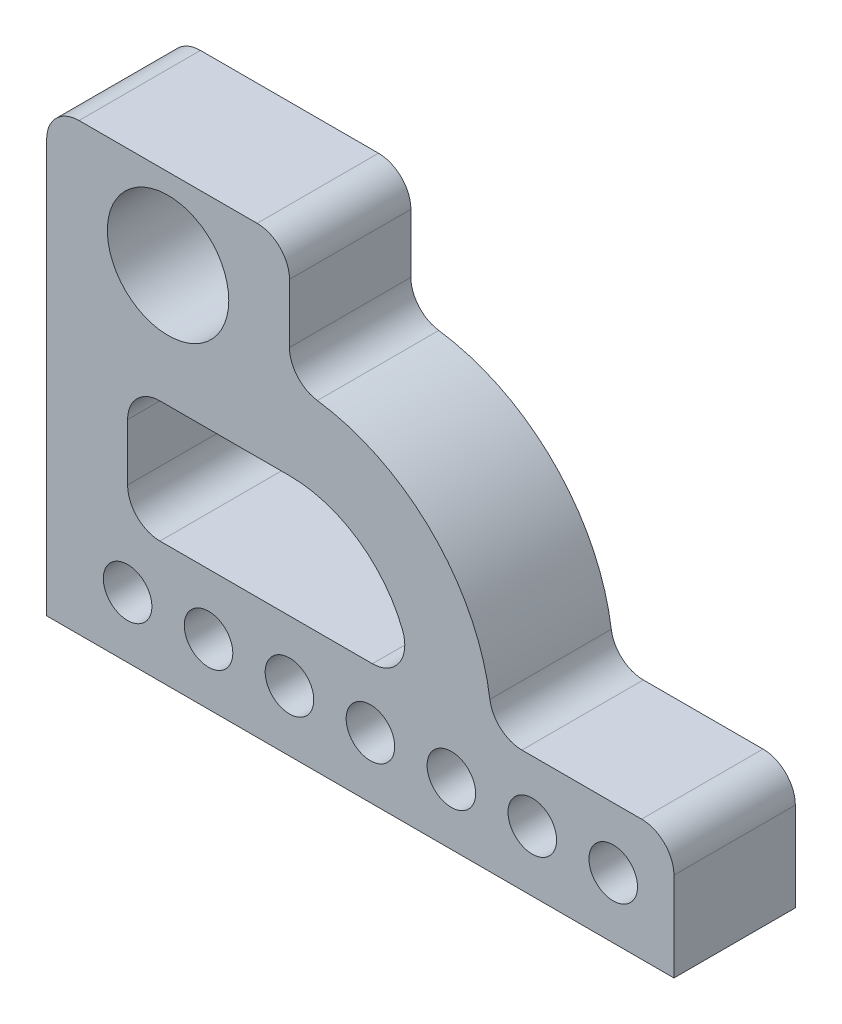
ISO-10303-21;
HEADER;
FILE_DESCRIPTION(('STEP AP214'),'2;1');
FILE_NAME('part.step','',(''),(''),'','','');
FILE_SCHEMA(('AUTOMOTIVE_DESIGN { 1 0 10303 214 1 1 1 1 }'));
ENDSEC;
DATA;
#1=APPLICATION_CONTEXT('core data for automotive mechanical design processes');
#2=APPLICATION_PROTOCOL_DEFINITION('international standard','automotive_design',2000,#1);
#3=PRODUCT_CONTEXT('',#1,'mechanical');
#4=PRODUCT('Part','Part','',(#3));
#5=PRODUCT_RELATED_PRODUCT_CATEGORY('part','',(#4));
#6=PRODUCT_DEFINITION_FORMATION('','',#4);
#7=PRODUCT_DEFINITION_CONTEXT('part definition',#1,'design');
#8=PRODUCT_DEFINITION('design','',#6,#7);
#9=PRODUCT_DEFINITION_SHAPE('','',#8);
#10=(LENGTH_UNIT() NAMED_UNIT(*) SI_UNIT(.MILLI.,.METRE.));
#11=(NAMED_UNIT(*) PLANE_ANGLE_UNIT() SI_UNIT($,.RADIAN.));
#12=(NAMED_UNIT(*) SI_UNIT($,.STERADIAN.) SOLID_ANGLE_UNIT());
#13=UNCERTAINTY_MEASURE_WITH_UNIT(LENGTH_MEASURE(1.E-05),#10,'distance_accuracy_value','');
#14=(GEOMETRIC_REPRESENTATION_CONTEXT(3) GLOBAL_UNCERTAINTY_ASSIGNED_CONTEXT((#13)) GLOBAL_UNIT_ASSIGNED_CONTEXT((#10,
#11,#12)) REPRESENTATION_CONTEXT('',''));
#15=CARTESIAN_POINT('',(0.,0.,0.));
#16=DIRECTION('',(0.,0.,1.));
#17=DIRECTION('',(1.,0.,0.));
#18=AXIS2_PLACEMENT_3D('',#15,#16,#17);
#19=CARTESIAN_POINT('',(-82.8411214953271,71.5579771921026,30.));
#20=DIRECTION('',(0.,0.,-1.));
#21=DIRECTION('',(-1.,0.,0.));
#22=AXIS2_PLACEMENT_3D('',#19,#20,#21);
#23=PLANE('',#22);
#24=DIRECTION('',(0.,-1.,0.));
#25=VECTOR('',#24,1.);
#26=CARTESIAN_POINT('',(-70.8411214953271,0.,30.));
#27=LINE('',#26,#25);
#28=CARTESIAN_POINT('',(-70.8411214953271,21.5579771921025,30.));
#29=VERTEX_POINT('',#28);
#30=CARTESIAN_POINT('',(-70.8411214953271,7.55797719210254,30.));
#31=VERTEX_POINT('',#30);
#32=EDGE_CURVE('E545',#29,#31,#27,.T.);
#33=ORIENTED_EDGE('',*,*,#32,.F.);
#34=CARTESIAN_POINT('',(-62.8411214953271,21.5579771921025,30.));
#35=DIRECTION('',(0.,0.,1.));
#36=DIRECTION('',(1.,0.,0.));
#37=AXIS2_PLACEMENT_3D('',#34,#35,#36);
#38=CIRCLE('',#37,8.);
#39=CARTESIAN_POINT('',(-62.8411214953271,29.5579771921025,30.));
#40=VERTEX_POINT('',#39);
#41=EDGE_CURVE('E554',#29,#40,#38,.F.);
#42=ORIENTED_EDGE('',*,*,#41,.T.);
#43=DIRECTION('',(-1.,0.,0.));
#44=VECTOR('',#43,1.);
#45=CARTESIAN_POINT('',(0.,29.5579771921025,30.));
#46=LINE('',#45,#44);
#47=CARTESIAN_POINT('',(-30.8411214953271,29.5579771921025,30.));
#48=VERTEX_POINT('',#47);
#49=EDGE_CURVE('E582',#48,#40,#46,.T.);
#50=ORIENTED_EDGE('',*,*,#49,.F.);
#51=CARTESIAN_POINT('',(-30.8411214953271,-0.442022807897458,30.));
#52=DIRECTION('',(0.,0.,1.));
#53=DIRECTION('',(1.,0.,0.));
#54=AXIS2_PLACEMENT_3D('',#51,#52,#53);
#55=CIRCLE('',#54,30.);
#56=CARTESIAN_POINT('',(-2.89489213361911,10.4670681011935,30.));
#57=VERTEX_POINT('',#56);
#58=EDGE_CURVE('E579',#57,#48,#55,.T.);
#59=ORIENTED_EDGE('',*,*,#58,.F.);
#60=CARTESIAN_POINT('',(-10.3472199634079,7.55797719210254,30.));
#61=DIRECTION('',(0.,0.,1.));
#62=DIRECTION('',(1.,0.,0.));
#63=AXIS2_PLACEMENT_3D('',#60,#61,#62);
#64=CIRCLE('',#63,8.);
#65=CARTESIAN_POINT('',(-10.3472199634079,-0.442022807897458,30.));
#66=VERTEX_POINT('',#65);
#67=EDGE_CURVE('E576',#66,#57,#64,.T.);
#68=ORIENTED_EDGE('',*,*,#67,.F.);
#69=DIRECTION('',(1.,0.,0.));
#70=VECTOR('',#69,1.);
#71=CARTESIAN_POINT('',(0.,-0.442022807897458,30.));
#72=LINE('',#71,#70);
#73=CARTESIAN_POINT('',(-62.8411214953271,-0.442022807897458,30.));
#74=VERTEX_POINT('',#73);
#75=EDGE_CURVE('E570',#74,#66,#72,.T.);
#76=ORIENTED_EDGE('',*,*,#75,.F.);
#77=CARTESIAN_POINT('',(-62.8411214953271,7.55797719210254,30.));
#78=DIRECTION('',(0.,0.,1.));
#79=DIRECTION('',(1.,0.,0.));
#80=AXIS2_PLACEMENT_3D('',#77,#78,#79);
#81=CIRCLE('',#80,8.);
#82=EDGE_CURVE('E566',#74,#31,#81,.F.);
#83=ORIENTED_EDGE('',*,*,#82,.T.);
#84=EDGE_LOOP('',(#33,#42,#50,#59,#68,#76,#83));
#85=FACE_BOUND('',#84,.T.);
#86=CARTESIAN_POINT('',(-82.8411214953271,71.5579771921026,30.));
#87=DIRECTION('',(0.,0.,-1.));
#88=DIRECTION('',(-1.,0.,0.));
#89=AXIS2_PLACEMENT_3D('',#86,#87,#88);
#90=CIRCLE('',#89,8.00000000000001);
#91=CARTESIAN_POINT('',(-90.8411214953271,71.5579771921026,30.));
#92=VERTEX_POINT('',#91);
#93=CARTESIAN_POINT('',(-82.8411214953271,79.5579771921025,30.));
#94=VERTEX_POINT('',#93);
#95=EDGE_CURVE('E632',#92,#94,#90,.T.);
#96=ORIENTED_EDGE('',*,*,#95,.F.);
#97=DIRECTION('',(0.,-1.,0.));
#98=VECTOR('',#97,1.);
#99=CARTESIAN_POINT('',(-90.8411214953271,71.5579771921026,30.));
#100=LINE('',#99,#98);
#101=CARTESIAN_POINT('',(-90.8411214953271,-30.4420228078975,30.));
#102=VERTEX_POINT('',#101);
#103=EDGE_CURVE('E670',#92,#102,#100,.T.);
#104=ORIENTED_EDGE('',*,*,#103,.T.);
#105=DIRECTION('',(1.,0.,0.));
#106=VECTOR('',#105,1.);
#107=CARTESIAN_POINT('',(-90.8411214953271,-30.4420228078975,30.));
#108=LINE('',#107,#106);
#109=CARTESIAN_POINT('',(64.1588785046729,-30.4420228078975,30.));
#110=VERTEX_POINT('',#109);
#111=EDGE_CURVE('E667',#102,#110,#108,.T.);
#112=ORIENTED_EDGE('',*,*,#111,.T.);
#113=DIRECTION('',(0.,1.,0.));
#114=VECTOR('',#113,1.);
#115=CARTESIAN_POINT('',(64.1588785046729,-30.4420228078975,30.));
#116=LINE('',#115,#114);
#117=CARTESIAN_POINT('',(64.1588785046729,-8.44202280789746,30.));
#118=VERTEX_POINT('',#117);
#119=EDGE_CURVE('E664',#110,#118,#116,.T.);
#120=ORIENTED_EDGE('',*,*,#119,.T.);
#121=CARTESIAN_POINT('',(56.1588785046729,-8.44202280789746,30.));
#122=DIRECTION('',(0.,0.,1.));
#123=DIRECTION('',(1.,0.,0.));
#124=AXIS2_PLACEMENT_3D('',#121,#122,#123);
#125=CIRCLE('',#124,7.99999999999999);
#126=CARTESIAN_POINT('',(56.1588785046729,-0.442022807897464,30.));
#127=VERTEX_POINT('',#126);
#128=EDGE_CURVE('E661',#118,#127,#125,.T.);
#129=ORIENTED_EDGE('',*,*,#128,.T.);
#130=DIRECTION('',(-1.,0.,0.));
#131=VECTOR('',#130,1.);
#132=CARTESIAN_POINT('',(56.1588785046729,-0.442022807897459,30.));
#133=LINE('',#132,#131);
#134=CARTESIAN_POINT('',(26.6045049700532,-0.442022807897463,30.));
#135=VERTEX_POINT('',#134);
#136=EDGE_CURVE('E658',#127,#135,#133,.T.);
#137=ORIENTED_EDGE('',*,*,#136,.T.);
#138=CARTESIAN_POINT('',(26.6045049700532,7.55797719210254,30.));
#139=DIRECTION('',(0.,0.,-1.));
#140=DIRECTION('',(-1.,0.,0.));
#141=AXIS2_PLACEMENT_3D('',#138,#139,#140);
#142=CIRCLE('',#141,8.);
#143=CARTESIAN_POINT('',(18.6809702851732,6.45452891624047,30.));
#144=VERTEX_POINT('',#143);
#145=EDGE_CURVE('E655',#135,#144,#142,.T.);
#146=ORIENTED_EDGE('',*,*,#145,.T.);
#147=CARTESIAN_POINT('',(-30.8411214953271,-0.442022807897458,30.));
#148=DIRECTION('',(0.,0.,-1.));
#149=DIRECTION('',(-1.,0.,0.));
#150=AXIS2_PLACEMENT_3D('',#147,#148,#149);
#151=CIRCLE('',#150,50.);
#152=CARTESIAN_POINT('',(-23.9445697711892,49.0800689726028,30.));
#153=VERTEX_POINT('',#152);
#154=EDGE_CURVE('E651',#153,#144,#151,.T.);
#155=ORIENTED_EDGE('',*,*,#154,.F.);
#156=CARTESIAN_POINT('',(-22.8411214953271,57.0036036574828,30.));
#157=DIRECTION('',(0.,0.,-1.));
#158=DIRECTION('',(-1.,0.,0.));
#159=AXIS2_PLACEMENT_3D('',#156,#157,#158);
#160=CIRCLE('',#159,8.);
#161=CARTESIAN_POINT('',(-30.8411214953271,57.0036036574828,30.));
#162=VERTEX_POINT('',#161);
#163=EDGE_CURVE('E648',#153,#162,#160,.T.);
#164=ORIENTED_EDGE('',*,*,#163,.T.);
#165=DIRECTION('',(0.,-1.,0.));
#166=VECTOR('',#165,1.);
#167=CARTESIAN_POINT('',(-30.8411214953271,71.5579771921026,30.));
#168=LINE('',#167,#166);
#169=CARTESIAN_POINT('',(-30.8411214953271,71.5579771921026,30.));
#170=VERTEX_POINT('',#169);
#171=EDGE_CURVE('E644',#170,#162,#168,.T.);
#172=ORIENTED_EDGE('',*,*,#171,.F.);
#173=CARTESIAN_POINT('',(-38.8411214953271,71.5579771921026,30.));
#174=DIRECTION('',(0.,0.,1.));
#175=DIRECTION('',(1.,0.,0.));
#176=AXIS2_PLACEMENT_3D('',#173,#174,#175);
#177=CIRCLE('',#176,8.);
#178=CARTESIAN_POINT('',(-38.8411214953271,79.5579771921025,30.));
#179=VERTEX_POINT('',#178);
#180=EDGE_CURVE('E641',#170,#179,#177,.T.);
#181=ORIENTED_EDGE('',*,*,#180,.T.);
#182=DIRECTION('',(1.,0.,0.));
#183=VECTOR('',#182,1.);
#184=CARTESIAN_POINT('',(-82.8411214953271,79.5579771921025,30.));
#185=LINE('',#184,#183);
#186=EDGE_CURVE('E636',#94,#179,#185,.T.);
#187=ORIENTED_EDGE('',*,*,#186,.F.);
#188=EDGE_LOOP('',(#96,#104,#112,#120,#129,#137,#146,#155,#164,#172,#181,#187));
#189=FACE_BOUND('',#188,.T.);
#190=CARTESIAN_POINT('',(-60.8411214953271,59.5579771921025,30.));
#191=DIRECTION('',(0.,0.,1.));
#192=DIRECTION('',(1.,0.,0.));
#193=AXIS2_PLACEMENT_3D('',#190,#191,#192);
#194=CIRCLE('',#193,15.);
#195=CARTESIAN_POINT('',(-45.8411214953271,59.5579771921025,30.));
#196=VERTEX_POINT('',#195);
#197=EDGE_CURVE('E624',#196,#196,#194,.T.);
#198=ORIENTED_EDGE('',*,*,#197,.F.);
#199=EDGE_LOOP('',(#198));
#200=FACE_BOUND('',#199,.T.);
#201=CARTESIAN_POINT('',(-50.8411214953271,-15.4420228078975,30.));
#202=DIRECTION('',(0.,0.,1.));
#203=DIRECTION('',(1.,0.,0.));
#204=AXIS2_PLACEMENT_3D('',#201,#202,#203);
#205=CIRCLE('',#204,6.);
#206=CARTESIAN_POINT('',(-44.8411214953271,-15.4420228078975,30.));
#207=VERTEX_POINT('',#206);
#208=EDGE_CURVE('E587',#207,#207,#205,.T.);
#209=ORIENTED_EDGE('',*,*,#208,.F.);
#210=EDGE_LOOP('',(#209));
#211=FACE_BOUND('',#210,.T.);
#212=CARTESIAN_POINT('',(-30.8411214953271,-15.4420228078975,30.));
#213=DIRECTION('',(0.,0.,1.));
#214=DIRECTION('',(1.,0.,0.));
#215=AXIS2_PLACEMENT_3D('',#212,#213,#214);
#216=CIRCLE('',#215,6.);
#217=CARTESIAN_POINT('',(-24.8411214953271,-15.4420228078975,30.));
#218=VERTEX_POINT('',#217);
#219=EDGE_CURVE('E1143',#218,#218,#216,.T.);
#220=ORIENTED_EDGE('',*,*,#219,.F.);
#221=EDGE_LOOP('',(#220));
#222=FACE_BOUND('',#221,.T.);
#223=CARTESIAN_POINT('',(9.15887850467292,-15.4420228078975,30.));
#224=DIRECTION('',(0.,0.,1.));
#225=DIRECTION('',(1.,0.,0.));
#226=AXIS2_PLACEMENT_3D('',#223,#224,#225);
#227=CIRCLE('',#226,6.);
#228=CARTESIAN_POINT('',(15.1588785046729,-15.4420228078975,30.));
#229=VERTEX_POINT('',#228);
#230=EDGE_CURVE('E1135',#229,#229,#227,.T.);
#231=ORIENTED_EDGE('',*,*,#230,.F.);
#232=EDGE_LOOP('',(#231));
#233=FACE_BOUND('',#232,.T.);
#234=CARTESIAN_POINT('',(29.1588785046729,-15.4420228078975,30.));
#235=DIRECTION('',(0.,0.,1.));
#236=DIRECTION('',(1.,0.,0.));
#237=AXIS2_PLACEMENT_3D('',#234,#235,#236);
#238=CIRCLE('',#237,6.);
#239=CARTESIAN_POINT('',(35.1588785046729,-15.4420228078975,30.));
#240=VERTEX_POINT('',#239);
#241=EDGE_CURVE('E1127',#240,#240,#238,.T.);
#242=ORIENTED_EDGE('',*,*,#241,.F.);
#243=EDGE_LOOP('',(#242));
#244=FACE_BOUND('',#243,.T.);
#245=CARTESIAN_POINT('',(49.1588785046729,-15.4420228078975,30.));
#246=DIRECTION('',(0.,0.,1.));
#247=DIRECTION('',(1.,0.,0.));
#248=AXIS2_PLACEMENT_3D('',#245,#246,#247);
#249=CIRCLE('',#248,6.);
#250=CARTESIAN_POINT('',(55.1588785046729,-15.4420228078975,30.));
#251=VERTEX_POINT('',#250);
#252=EDGE_CURVE('E1119',#251,#251,#249,.T.);
#253=ORIENTED_EDGE('',*,*,#252,.F.);
#254=EDGE_LOOP('',(#253));
#255=FACE_BOUND('',#254,.T.);
#256=CARTESIAN_POINT('',(-70.8411214953271,-15.4420228078975,30.));
#257=DIRECTION('',(0.,0.,1.));
#258=DIRECTION('',(1.,0.,0.));
#259=AXIS2_PLACEMENT_3D('',#256,#257,#258);
#260=CIRCLE('',#259,6.);
#261=CARTESIAN_POINT('',(-64.8411214953271,-15.4420228078975,30.));
#262=VERTEX_POINT('',#261);
#263=EDGE_CURVE('E1111',#262,#262,#260,.T.);
#264=ORIENTED_EDGE('',*,*,#263,.F.);
#265=EDGE_LOOP('',(#264));
#266=FACE_BOUND('',#265,.T.);
#267=CARTESIAN_POINT('',(-10.8411214953271,-15.4420228078975,30.));
#268=DIRECTION('',(0.,0.,1.));
#269=DIRECTION('',(1.,0.,0.));
#270=AXIS2_PLACEMENT_3D('',#267,#268,#269);
#271=CIRCLE('',#270,6.);
#272=CARTESIAN_POINT('',(-4.84112149532708,-15.4420228078975,30.));
#273=VERTEX_POINT('',#272);
#274=EDGE_CURVE('E1100',#273,#273,#271,.T.);
#275=ORIENTED_EDGE('',*,*,#274,.F.);
#276=EDGE_LOOP('',(#275));
#277=FACE_BOUND('',#276,.T.);
#278=ADVANCED_FACE('F408',(#85,#189,#200,#211,#222,#233,#244,#255,#266,#277),#23,.F.);
#279=CARTESIAN_POINT('',(-82.8411214953271,71.5579771921026,0.));
#280=DIRECTION('',(0.,0.,-1.));
#281=DIRECTION('',(-1.,0.,0.));
#282=AXIS2_PLACEMENT_3D('',#279,#280,#281);
#283=PLANE('',#282);
#284=CARTESIAN_POINT('',(-70.8411214953271,-15.4420228078975,0.));
#285=DIRECTION('',(0.,0.,1.));
#286=DIRECTION('',(1.,0.,0.));
#287=AXIS2_PLACEMENT_3D('',#284,#285,#286);
#288=CIRCLE('',#287,6.);
#289=CARTESIAN_POINT('',(-64.8411214953271,-15.4420228078975,0.));
#290=VERTEX_POINT('',#289);
#291=EDGE_CURVE('E1108',#290,#290,#288,.T.);
#292=ORIENTED_EDGE('',*,*,#291,.T.);
#293=EDGE_LOOP('',(#292));
#294=FACE_BOUND('',#293,.T.);
#295=CARTESIAN_POINT('',(29.1588785046729,-15.4420228078975,0.));
#296=DIRECTION('',(0.,0.,1.));
#297=DIRECTION('',(1.,0.,0.));
#298=AXIS2_PLACEMENT_3D('',#295,#296,#297);
#299=CIRCLE('',#298,6.);
#300=CARTESIAN_POINT('',(35.1588785046729,-15.4420228078975,0.));
#301=VERTEX_POINT('',#300);
#302=EDGE_CURVE('E1123',#301,#301,#299,.T.);
#303=ORIENTED_EDGE('',*,*,#302,.T.);
#304=EDGE_LOOP('',(#303));
#305=FACE_BOUND('',#304,.T.);
#306=CARTESIAN_POINT('',(-30.8411214953271,-15.4420228078975,0.));
#307=DIRECTION('',(0.,0.,1.));
#308=DIRECTION('',(1.,0.,0.));
#309=AXIS2_PLACEMENT_3D('',#306,#307,#308);
#310=CIRCLE('',#309,6.);
#311=CARTESIAN_POINT('',(-24.8411214953271,-15.4420228078975,0.));
#312=VERTEX_POINT('',#311);
#313=EDGE_CURVE('E1139',#312,#312,#310,.T.);
#314=ORIENTED_EDGE('',*,*,#313,.T.);
#315=EDGE_LOOP('',(#314));
#316=FACE_BOUND('',#315,.T.);
#317=CARTESIAN_POINT('',(-60.8411214953271,59.5579771921025,0.));
#318=DIRECTION('',(0.,0.,1.));
#319=DIRECTION('',(1.,0.,0.));
#320=AXIS2_PLACEMENT_3D('',#317,#318,#319);
#321=CIRCLE('',#320,15.);
#322=CARTESIAN_POINT('',(-45.8411214953271,59.5579771921025,0.));
#323=VERTEX_POINT('',#322);
#324=EDGE_CURVE('E550',#323,#323,#321,.T.);
#325=ORIENTED_EDGE('',*,*,#324,.T.);
#326=EDGE_LOOP('',(#325));
#327=FACE_BOUND('',#326,.T.);
#328=CARTESIAN_POINT('',(-82.8411214953271,71.5579771921026,0.));
#329=DIRECTION('',(0.,0.,-1.));
#330=DIRECTION('',(-1.,0.,0.));
#331=AXIS2_PLACEMENT_3D('',#328,#329,#330);
#332=CIRCLE('',#331,8.00000000000001);
#333=CARTESIAN_POINT('',(-90.8411214953271,71.5579771921026,0.));
#334=VERTEX_POINT('',#333);
#335=CARTESIAN_POINT('',(-82.8411214953271,79.5579771921025,0.));
#336=VERTEX_POINT('',#335);
#337=EDGE_CURVE('E628',#334,#336,#332,.T.);
#338=ORIENTED_EDGE('',*,*,#337,.T.);
#339=DIRECTION('',(1.,0.,0.));
#340=VECTOR('',#339,1.);
#341=CARTESIAN_POINT('',(-82.8411214953271,79.5579771921025,0.));
#342=LINE('',#341,#340);
#343=CARTESIAN_POINT('',(-38.8411214953271,79.5579771921025,0.));
#344=VERTEX_POINT('',#343);
#345=EDGE_CURVE('E676',#336,#344,#342,.T.);
#346=ORIENTED_EDGE('',*,*,#345,.T.);
#347=CARTESIAN_POINT('',(-38.8411214953271,71.5579771921026,0.));
#348=DIRECTION('',(0.,0.,1.));
#349=DIRECTION('',(1.,0.,0.));
#350=AXIS2_PLACEMENT_3D('',#347,#348,#349);
#351=CIRCLE('',#350,8.);
#352=CARTESIAN_POINT('',(-30.8411214953271,71.5579771921026,0.));
#353=VERTEX_POINT('',#352);
#354=EDGE_CURVE('E680',#353,#344,#351,.T.);
#355=ORIENTED_EDGE('',*,*,#354,.F.);
#356=DIRECTION('',(0.,-1.,0.));
#357=VECTOR('',#356,1.);
#358=CARTESIAN_POINT('',(-30.8411214953271,71.5579771921026,0.));
#359=LINE('',#358,#357);
#360=CARTESIAN_POINT('',(-30.8411214953271,57.0036036574828,0.));
#361=VERTEX_POINT('',#360);
#362=EDGE_CURVE('E684',#353,#361,#359,.T.);
#363=ORIENTED_EDGE('',*,*,#362,.T.);
#364=CARTESIAN_POINT('',(-22.8411214953271,57.0036036574828,0.));
#365=DIRECTION('',(0.,0.,-1.));
#366=DIRECTION('',(-1.,0.,0.));
#367=AXIS2_PLACEMENT_3D('',#364,#365,#366);
#368=CIRCLE('',#367,8.);
#369=CARTESIAN_POINT('',(-23.9445697711892,49.0800689726028,0.));
#370=VERTEX_POINT('',#369);
#371=EDGE_CURVE('E688',#370,#361,#368,.T.);
#372=ORIENTED_EDGE('',*,*,#371,.F.);
#373=CARTESIAN_POINT('',(-30.8411214953271,-0.442022807897458,0.));
#374=DIRECTION('',(0.,0.,-1.));
#375=DIRECTION('',(-1.,0.,0.));
#376=AXIS2_PLACEMENT_3D('',#373,#374,#375);
#377=CIRCLE('',#376,50.);
#378=CARTESIAN_POINT('',(18.6809702851732,6.45452891624047,0.));
#379=VERTEX_POINT('',#378);
#380=EDGE_CURVE('E692',#370,#379,#377,.T.);
#381=ORIENTED_EDGE('',*,*,#380,.T.);
#382=CARTESIAN_POINT('',(26.6045049700532,7.55797719210254,0.));
#383=DIRECTION('',(0.,0.,-1.));
#384=DIRECTION('',(-1.,0.,0.));
#385=AXIS2_PLACEMENT_3D('',#382,#383,#384);
#386=CIRCLE('',#385,8.);
#387=CARTESIAN_POINT('',(26.6045049700532,-0.442022807897463,0.));
#388=VERTEX_POINT('',#387);
#389=EDGE_CURVE('E696',#388,#379,#386,.T.);
#390=ORIENTED_EDGE('',*,*,#389,.F.);
#391=DIRECTION('',(-1.,0.,0.));
#392=VECTOR('',#391,1.);
#393=CARTESIAN_POINT('',(56.1588785046729,-0.442022807897459,0.));
#394=LINE('',#393,#392);
#395=CARTESIAN_POINT('',(56.1588785046729,-0.442022807897464,0.));
#396=VERTEX_POINT('',#395);
#397=EDGE_CURVE('E700',#396,#388,#394,.T.);
#398=ORIENTED_EDGE('',*,*,#397,.F.);
#399=CARTESIAN_POINT('',(56.1588785046729,-8.44202280789746,0.));
#400=DIRECTION('',(0.,0.,1.));
#401=DIRECTION('',(1.,0.,0.));
#402=AXIS2_PLACEMENT_3D('',#399,#400,#401);
#403=CIRCLE('',#402,7.99999999999999);
#404=CARTESIAN_POINT('',(64.1588785046729,-8.44202280789746,0.));
#405=VERTEX_POINT('',#404);
#406=EDGE_CURVE('E703',#405,#396,#403,.T.);
#407=ORIENTED_EDGE('',*,*,#406,.F.);
#408=DIRECTION('',(0.,1.,0.));
#409=VECTOR('',#408,1.);
#410=CARTESIAN_POINT('',(64.1588785046729,-30.4420228078975,0.));
#411=LINE('',#410,#409);
#412=CARTESIAN_POINT('',(64.1588785046729,-30.4420228078975,0.));
#413=VERTEX_POINT('',#412);
#414=EDGE_CURVE('E706',#413,#405,#411,.T.);
#415=ORIENTED_EDGE('',*,*,#414,.F.);
#416=DIRECTION('',(1.,0.,0.));
#417=VECTOR('',#416,1.);
#418=CARTESIAN_POINT('',(-90.8411214953271,-30.4420228078975,0.));
#419=LINE('',#418,#417);
#420=CARTESIAN_POINT('',(-90.8411214953271,-30.4420228078975,0.));
#421=VERTEX_POINT('',#420);
#422=EDGE_CURVE('E709',#421,#413,#419,.T.);
#423=ORIENTED_EDGE('',*,*,#422,.F.);
#424=DIRECTION('',(0.,-1.,0.));
#425=VECTOR('',#424,1.);
#426=CARTESIAN_POINT('',(-90.8411214953271,71.5579771921026,0.));
#427=LINE('',#426,#425);
#428=EDGE_CURVE('E637',#334,#421,#427,.T.);
#429=ORIENTED_EDGE('',*,*,#428,.F.);
#430=EDGE_LOOP('',(#338,#346,#355,#363,#372,#381,#390,#398,#407,#415,#423,#429));
#431=FACE_BOUND('',#430,.T.);
#432=CARTESIAN_POINT('',(-62.8411214953271,21.5579771921025,0.));
#433=DIRECTION('',(0.,0.,1.));
#434=DIRECTION('',(1.,0.,0.));
#435=AXIS2_PLACEMENT_3D('',#432,#433,#434);
#436=CIRCLE('',#435,8.);
#437=CARTESIAN_POINT('',(-70.8411214953271,21.5579771921025,0.));
#438=VERTEX_POINT('',#437);
#439=CARTESIAN_POINT('',(-62.8411214953271,29.5579771921025,0.));
#440=VERTEX_POINT('',#439);
#441=EDGE_CURVE('E434',#438,#440,#436,.F.);
#442=ORIENTED_EDGE('',*,*,#441,.F.);
#443=DIRECTION('',(0.,-1.,0.));
#444=VECTOR('',#443,1.);
#445=CARTESIAN_POINT('',(-70.8411214953271,0.,0.));
#446=LINE('',#445,#444);
#447=CARTESIAN_POINT('',(-70.8411214953271,7.55797719210254,0.));
#448=VERTEX_POINT('',#447);
#449=EDGE_CURVE('E548',#438,#448,#446,.T.);
#450=ORIENTED_EDGE('',*,*,#449,.T.);
#451=CARTESIAN_POINT('',(-62.8411214953271,7.55797719210254,0.));
#452=DIRECTION('',(0.,0.,1.));
#453=DIRECTION('',(1.,0.,0.));
#454=AXIS2_PLACEMENT_3D('',#451,#452,#453);
#455=CIRCLE('',#454,8.);
#456=CARTESIAN_POINT('',(-62.8411214953271,-0.442022807897458,0.));
#457=VERTEX_POINT('',#456);
#458=EDGE_CURVE('E590',#457,#448,#455,.F.);
#459=ORIENTED_EDGE('',*,*,#458,.F.);
#460=DIRECTION('',(1.,0.,0.));
#461=VECTOR('',#460,1.);
#462=CARTESIAN_POINT('',(0.,-0.442022807897458,0.));
#463=LINE('',#462,#461);
#464=CARTESIAN_POINT('',(-10.3472199634079,-0.442022807897458,0.));
#465=VERTEX_POINT('',#464);
#466=EDGE_CURVE('E594',#457,#465,#463,.T.);
#467=ORIENTED_EDGE('',*,*,#466,.T.);
#468=CARTESIAN_POINT('',(-10.3472199634079,7.55797719210254,0.));
#469=DIRECTION('',(0.,0.,1.));
#470=DIRECTION('',(1.,0.,0.));
#471=AXIS2_PLACEMENT_3D('',#468,#469,#470);
#472=CIRCLE('',#471,8.);
#473=CARTESIAN_POINT('',(-2.89489213361911,10.4670681011935,0.));
#474=VERTEX_POINT('',#473);
#475=EDGE_CURVE('E598',#465,#474,#472,.T.);
#476=ORIENTED_EDGE('',*,*,#475,.T.);
#477=CARTESIAN_POINT('',(-30.8411214953271,-0.442022807897458,0.));
#478=DIRECTION('',(0.,0.,1.));
#479=DIRECTION('',(1.,0.,0.));
#480=AXIS2_PLACEMENT_3D('',#477,#478,#479);
#481=CIRCLE('',#480,30.);
#482=CARTESIAN_POINT('',(-30.8411214953271,29.5579771921025,0.));
#483=VERTEX_POINT('',#482);
#484=EDGE_CURVE('E602',#474,#483,#481,.T.);
#485=ORIENTED_EDGE('',*,*,#484,.T.);
#486=DIRECTION('',(-1.,0.,0.));
#487=VECTOR('',#486,1.);
#488=CARTESIAN_POINT('',(0.,29.5579771921025,0.));
#489=LINE('',#488,#487);
#490=EDGE_CURVE('E560',#483,#440,#489,.T.);
#491=ORIENTED_EDGE('',*,*,#490,.T.);
#492=EDGE_LOOP('',(#442,#450,#459,#467,#476,#485,#491));
#493=FACE_BOUND('',#492,.T.);
#494=CARTESIAN_POINT('',(-50.8411214953271,-15.4420228078975,0.));
#495=DIRECTION('',(0.,0.,1.));
#496=DIRECTION('',(1.,0.,0.));
#497=AXIS2_PLACEMENT_3D('',#494,#495,#496);
#498=CIRCLE('',#497,6.);
#499=CARTESIAN_POINT('',(-44.8411214953271,-15.4420228078975,0.));
#500=VERTEX_POINT('',#499);
#501=EDGE_CURVE('E1147',#500,#500,#498,.T.);
#502=ORIENTED_EDGE('',*,*,#501,.T.);
#503=EDGE_LOOP('',(#502));
#504=FACE_BOUND('',#503,.T.);
#505=CARTESIAN_POINT('',(9.15887850467292,-15.4420228078975,0.));
#506=DIRECTION('',(0.,0.,1.));
#507=DIRECTION('',(1.,0.,0.));
#508=AXIS2_PLACEMENT_3D('',#505,#506,#507);
#509=CIRCLE('',#508,6.);
#510=CARTESIAN_POINT('',(15.1588785046729,-15.4420228078975,0.));
#511=VERTEX_POINT('',#510);
#512=EDGE_CURVE('E1131',#511,#511,#509,.T.);
#513=ORIENTED_EDGE('',*,*,#512,.T.);
#514=EDGE_LOOP('',(#513));
#515=FACE_BOUND('',#514,.T.);
#516=CARTESIAN_POINT('',(49.1588785046729,-15.4420228078975,0.));
#517=DIRECTION('',(0.,0.,1.));
#518=DIRECTION('',(1.,0.,0.));
#519=AXIS2_PLACEMENT_3D('',#516,#517,#518);
#520=CIRCLE('',#519,6.);
#521=CARTESIAN_POINT('',(55.1588785046729,-15.4420228078975,0.));
#522=VERTEX_POINT('',#521);
#523=EDGE_CURVE('E1115',#522,#522,#520,.T.);
#524=ORIENTED_EDGE('',*,*,#523,.T.);
#525=EDGE_LOOP('',(#524));
#526=FACE_BOUND('',#525,.T.);
#527=CARTESIAN_POINT('',(-10.8411214953271,-15.4420228078975,0.));
#528=DIRECTION('',(0.,0.,1.));
#529=DIRECTION('',(1.,0.,0.));
#530=AXIS2_PLACEMENT_3D('',#527,#528,#529);
#531=CIRCLE('',#530,6.);
#532=CARTESIAN_POINT('',(-4.84112149532708,-15.4420228078975,0.));
#533=VERTEX_POINT('',#532);
#534=EDGE_CURVE('E1103',#533,#533,#531,.T.);
#535=ORIENTED_EDGE('',*,*,#534,.T.);
#536=EDGE_LOOP('',(#535));
#537=FACE_BOUND('',#536,.T.);
#538=ADVANCED_FACE('F758',(#294,#305,#316,#327,#431,#493,#504,#515,#526,#537),#283,.T.);
#539=CARTESIAN_POINT('',(-82.8411214953271,71.5579771921026,30.));
#540=DIRECTION('',(0.,0.,-1.));
#541=DIRECTION('',(-1.,0.,0.));
#542=AXIS2_PLACEMENT_3D('',#539,#540,#541);
#543=CYLINDRICAL_SURFACE('',#542,8.00000000000001);
#544=ORIENTED_EDGE('',*,*,#337,.F.);
#545=DIRECTION('',(0.,0.,-1.));
#546=VECTOR('',#545,1.);
#547=CARTESIAN_POINT('',(-90.8411214953271,71.5579771921026,30.));
#548=LINE('',#547,#546);
#549=EDGE_CURVE('E12',#92,#334,#548,.T.);
#550=ORIENTED_EDGE('',*,*,#549,.F.);
#551=ORIENTED_EDGE('',*,*,#95,.T.);
#552=DIRECTION('',(0.,0.,-1.));
#553=VECTOR('',#552,1.);
#554=CARTESIAN_POINT('',(-82.8411214953271,79.5579771921025,30.));
#555=LINE('',#554,#553);
#556=EDGE_CURVE('E412',#94,#336,#555,.T.);
#557=ORIENTED_EDGE('',*,*,#556,.T.);
#558=EDGE_LOOP('',(#544,#550,#551,#557));
#559=FACE_BOUND('',#558,.T.);
#560=ADVANCED_FACE('F410',(#559),#543,.T.);
#561=CARTESIAN_POINT('',(-90.8411214953271,71.5579771921026,30.));
#562=DIRECTION('',(1.,0.,0.));
#563=DIRECTION('',(0.,1.,0.));
#564=AXIS2_PLACEMENT_3D('',#561,#562,#563);
#565=PLANE('',#564);
#566=ORIENTED_EDGE('',*,*,#428,.T.);
#567=DIRECTION('',(0.,0.,-1.));
#568=VECTOR('',#567,1.);
#569=CARTESIAN_POINT('',(-90.8411214953271,-30.4420228078975,30.));
#570=LINE('',#569,#568);
#571=EDGE_CURVE('E418',#102,#421,#570,.T.);
#572=ORIENTED_EDGE('',*,*,#571,.F.);
#573=ORIENTED_EDGE('',*,*,#103,.F.);
#574=ORIENTED_EDGE('',*,*,#549,.T.);
#575=EDGE_LOOP('',(#566,#572,#573,#574));
#576=FACE_BOUND('',#575,.T.);
#577=ADVANCED_FACE('F764',(#576),#565,.F.);
#578=CARTESIAN_POINT('',(-90.8411214953271,-30.4420228078975,30.));
#579=DIRECTION('',(0.,1.,0.));
#580=DIRECTION('',(0.,0.,1.));
#581=AXIS2_PLACEMENT_3D('',#578,#579,#580);
#582=PLANE('',#581);
#583=ORIENTED_EDGE('',*,*,#422,.T.);
#584=DIRECTION('',(0.,0.,-1.));
#585=VECTOR('',#584,1.);
#586=CARTESIAN_POINT('',(64.1588785046729,-30.4420228078975,30.));
#587=LINE('',#586,#585);
#588=EDGE_CURVE('E717',#110,#413,#587,.T.);
#589=ORIENTED_EDGE('',*,*,#588,.F.);
#590=ORIENTED_EDGE('',*,*,#111,.F.);
#591=ORIENTED_EDGE('',*,*,#571,.T.);
#592=EDGE_LOOP('',(#583,#589,#590,#591));
#593=FACE_BOUND('',#592,.T.);
#594=ADVANCED_FACE('F768',(#593),#582,.F.);
#595=CARTESIAN_POINT('',(64.1588785046729,-30.4420228078975,30.));
#596=DIRECTION('',(-1.,0.,0.));
#597=DIRECTION('',(0.,0.,1.));
#598=AXIS2_PLACEMENT_3D('',#595,#596,#597);
#599=PLANE('',#598);
#600=ORIENTED_EDGE('',*,*,#414,.T.);
#601=DIRECTION('',(0.,0.,-1.));
#602=VECTOR('',#601,1.);
#603=CARTESIAN_POINT('',(64.1588785046729,-8.44202280789746,30.));
#604=LINE('',#603,#602);
#605=EDGE_CURVE('E721',#118,#405,#604,.T.);
#606=ORIENTED_EDGE('',*,*,#605,.F.);
#607=ORIENTED_EDGE('',*,*,#119,.F.);
#608=ORIENTED_EDGE('',*,*,#588,.T.);
#609=EDGE_LOOP('',(#600,#606,#607,#608));
#610=FACE_BOUND('',#609,.T.);
#611=ADVANCED_FACE('F805',(#610),#599,.F.);
#612=CARTESIAN_POINT('',(56.1588785046729,-8.44202280789746,30.));
#613=DIRECTION('',(0.,0.,-1.));
#614=DIRECTION('',(-1.,0.,0.));
#615=AXIS2_PLACEMENT_3D('',#612,#613,#614);
#616=CYLINDRICAL_SURFACE('',#615,7.99999999999999);
#617=ORIENTED_EDGE('',*,*,#406,.T.);
#618=DIRECTION('',(0.,0.,-1.));
#619=VECTOR('',#618,1.);
#620=CARTESIAN_POINT('',(56.1588785046729,-0.442022807897464,30.));
#621=LINE('',#620,#619);
#622=EDGE_CURVE('E725',#127,#396,#621,.T.);
#623=ORIENTED_EDGE('',*,*,#622,.F.);
#624=ORIENTED_EDGE('',*,*,#128,.F.);
#625=ORIENTED_EDGE('',*,*,#605,.T.);
#626=EDGE_LOOP('',(#617,#623,#624,#625));
#627=FACE_BOUND('',#626,.T.);
#628=ADVANCED_FACE('F803',(#627),#616,.T.);
#629=CARTESIAN_POINT('',(56.1588785046729,-0.442022807897459,30.));
#630=DIRECTION('',(0.,-1.,0.));
#631=DIRECTION('',(1.,0.,0.));
#632=AXIS2_PLACEMENT_3D('',#629,#630,#631);
#633=PLANE('',#632);
#634=ORIENTED_EDGE('',*,*,#397,.T.);
#635=DIRECTION('',(0.,0.,-1.));
#636=VECTOR('',#635,1.);
#637=CARTESIAN_POINT('',(26.6045049700532,-0.442022807897463,30.));
#638=LINE('',#637,#636);
#639=EDGE_CURVE('E729',#135,#388,#638,.T.);
#640=ORIENTED_EDGE('',*,*,#639,.F.);
#641=ORIENTED_EDGE('',*,*,#136,.F.);
#642=ORIENTED_EDGE('',*,*,#622,.T.);
#643=EDGE_LOOP('',(#634,#640,#641,#642));
#644=FACE_BOUND('',#643,.T.);
#645=ADVANCED_FACE('F798',(#644),#633,.F.);
#646=CARTESIAN_POINT('',(26.6045049700532,7.55797719210254,30.));
#647=DIRECTION('',(0.,0.,-1.));
#648=DIRECTION('',(-1.,0.,0.));
#649=AXIS2_PLACEMENT_3D('',#646,#647,#648);
#650=CYLINDRICAL_SURFACE('',#649,8.);
#651=ORIENTED_EDGE('',*,*,#389,.T.);
#652=DIRECTION('',(0.,0.,-1.));
#653=VECTOR('',#652,1.);
#654=CARTESIAN_POINT('',(18.6809702851732,6.45452891624047,30.));
#655=LINE('',#654,#653);
#656=EDGE_CURVE('E733',#144,#379,#655,.T.);
#657=ORIENTED_EDGE('',*,*,#656,.F.);
#658=ORIENTED_EDGE('',*,*,#145,.F.);
#659=ORIENTED_EDGE('',*,*,#639,.T.);
#660=EDGE_LOOP('',(#651,#657,#658,#659));
#661=FACE_BOUND('',#660,.T.);
#662=ADVANCED_FACE('F793',(#661),#650,.F.);
#663=CARTESIAN_POINT('',(-30.8411214953271,-0.442022807897458,30.));
#664=DIRECTION('',(0.,0.,-1.));
#665=DIRECTION('',(-1.,0.,0.));
#666=AXIS2_PLACEMENT_3D('',#663,#664,#665);
#667=CYLINDRICAL_SURFACE('',#666,50.);
#668=ORIENTED_EDGE('',*,*,#380,.F.);
#669=DIRECTION('',(0.,0.,-1.));
#670=VECTOR('',#669,1.);
#671=CARTESIAN_POINT('',(-23.9445697711892,49.0800689726028,30.));
#672=LINE('',#671,#670);
#673=EDGE_CURVE('E736',#153,#370,#672,.T.);
#674=ORIENTED_EDGE('',*,*,#673,.F.);
#675=ORIENTED_EDGE('',*,*,#154,.T.);
#676=ORIENTED_EDGE('',*,*,#656,.T.);
#677=EDGE_LOOP('',(#668,#674,#675,#676));
#678=FACE_BOUND('',#677,.T.);
#679=ADVANCED_FACE('F788',(#678),#667,.T.);
#680=CARTESIAN_POINT('',(-22.8411214953271,57.0036036574828,30.));
#681=DIRECTION('',(0.,0.,-1.));
#682=DIRECTION('',(-1.,0.,0.));
#683=AXIS2_PLACEMENT_3D('',#680,#681,#682);
#684=CYLINDRICAL_SURFACE('',#683,8.);
#685=ORIENTED_EDGE('',*,*,#371,.T.);
#686=DIRECTION('',(0.,0.,-1.));
#687=VECTOR('',#686,1.);
#688=CARTESIAN_POINT('',(-30.8411214953271,57.0036036574828,30.));
#689=LINE('',#688,#687);
#690=EDGE_CURVE('E739',#162,#361,#689,.T.);
#691=ORIENTED_EDGE('',*,*,#690,.F.);
#692=ORIENTED_EDGE('',*,*,#163,.F.);
#693=ORIENTED_EDGE('',*,*,#673,.T.);
#694=EDGE_LOOP('',(#685,#691,#692,#693));
#695=FACE_BOUND('',#694,.T.);
#696=ADVANCED_FACE('F784',(#695),#684,.F.);
#697=CARTESIAN_POINT('',(-30.8411214953271,71.5579771921026,30.));
#698=DIRECTION('',(1.,0.,0.));
#699=DIRECTION('',(0.,1.,0.));
#700=AXIS2_PLACEMENT_3D('',#697,#698,#699);
#701=PLANE('',#700);
#702=ORIENTED_EDGE('',*,*,#362,.F.);
#703=DIRECTION('',(0.,0.,-1.));
#704=VECTOR('',#703,1.);
#705=CARTESIAN_POINT('',(-30.8411214953271,71.5579771921026,30.));
#706=LINE('',#705,#704);
#707=EDGE_CURVE('E742',#170,#353,#706,.T.);
#708=ORIENTED_EDGE('',*,*,#707,.F.);
#709=ORIENTED_EDGE('',*,*,#171,.T.);
#710=ORIENTED_EDGE('',*,*,#690,.T.);
#711=EDGE_LOOP('',(#702,#708,#709,#710));
#712=FACE_BOUND('',#711,.T.);
#713=ADVANCED_FACE('F780',(#712),#701,.T.);
#714=CARTESIAN_POINT('',(-38.8411214953271,71.5579771921026,30.));
#715=DIRECTION('',(0.,0.,-1.));
#716=DIRECTION('',(-1.,0.,0.));
#717=AXIS2_PLACEMENT_3D('',#714,#715,#716);
#718=CYLINDRICAL_SURFACE('',#717,8.);
#719=ORIENTED_EDGE('',*,*,#354,.T.);
#720=DIRECTION('',(0.,0.,-1.));
#721=VECTOR('',#720,1.);
#722=CARTESIAN_POINT('',(-38.8411214953271,79.5579771921025,30.));
#723=LINE('',#722,#721);
#724=EDGE_CURVE('E744',#179,#344,#723,.T.);
#725=ORIENTED_EDGE('',*,*,#724,.F.);
#726=ORIENTED_EDGE('',*,*,#180,.F.);
#727=ORIENTED_EDGE('',*,*,#707,.T.);
#728=EDGE_LOOP('',(#719,#725,#726,#727));
#729=FACE_BOUND('',#728,.T.);
#730=ADVANCED_FACE('F776',(#729),#718,.T.);
#731=CARTESIAN_POINT('',(-82.8411214953271,79.5579771921025,30.));
#732=DIRECTION('',(0.,1.,0.));
#733=DIRECTION('',(0.,0.,1.));
#734=AXIS2_PLACEMENT_3D('',#731,#732,#733);
#735=PLANE('',#734);
#736=ORIENTED_EDGE('',*,*,#345,.F.);
#737=ORIENTED_EDGE('',*,*,#556,.F.);
#738=ORIENTED_EDGE('',*,*,#186,.T.);
#739=ORIENTED_EDGE('',*,*,#724,.T.);
#740=EDGE_LOOP('',(#736,#737,#738,#739));
#741=FACE_BOUND('',#740,.T.);
#742=ADVANCED_FACE('F754',(#741),#735,.T.);
#743=CARTESIAN_POINT('',(-60.8411214953271,59.5579771921025,30.));
#744=DIRECTION('',(0.,0.,-1.));
#745=DIRECTION('',(-1.,0.,0.));
#746=AXIS2_PLACEMENT_3D('',#743,#744,#745);
#747=CYLINDRICAL_SURFACE('',#746,15.);
#748=ORIENTED_EDGE('',*,*,#197,.T.);
#749=EDGE_LOOP('',(#748));
#750=FACE_BOUND('',#749,.T.);
#751=ORIENTED_EDGE('',*,*,#324,.F.);
#752=EDGE_LOOP('',(#751));
#753=FACE_BOUND('',#752,.T.);
#754=ADVANCED_FACE('F822',(#750,#753),#747,.F.);
#755=CARTESIAN_POINT('',(-62.8411214953271,21.5579771921025,30.));
#756=DIRECTION('',(0.,0.,-1.));
#757=DIRECTION('',(-1.,0.,0.));
#758=AXIS2_PLACEMENT_3D('',#755,#756,#757);
#759=CYLINDRICAL_SURFACE('',#758,8.);
#760=ORIENTED_EDGE('',*,*,#441,.T.);
#761=DIRECTION('',(0.,0.,-1.));
#762=VECTOR('',#761,1.);
#763=CARTESIAN_POINT('',(-62.8411214953271,29.5579771921025,30.));
#764=LINE('',#763,#762);
#765=EDGE_CURVE('E556',#40,#440,#764,.T.);
#766=ORIENTED_EDGE('',*,*,#765,.F.);
#767=ORIENTED_EDGE('',*,*,#41,.F.);
#768=DIRECTION('',(0.,0.,-1.));
#769=VECTOR('',#768,1.);
#770=CARTESIAN_POINT('',(-70.8411214953271,21.5579771921025,30.));
#771=LINE('',#770,#769);
#772=EDGE_CURVE('E541',#29,#438,#771,.T.);
#773=ORIENTED_EDGE('',*,*,#772,.T.);
#774=EDGE_LOOP('',(#760,#766,#767,#773));
#775=FACE_BOUND('',#774,.T.);
#776=ADVANCED_FACE('F555',(#775),#759,.F.);
#777=CARTESIAN_POINT('',(-70.8411214953271,0.,30.));
#778=DIRECTION('',(1.,0.,0.));
#779=DIRECTION('',(0.,1.,0.));
#780=AXIS2_PLACEMENT_3D('',#777,#778,#779);
#781=PLANE('',#780);
#782=ORIENTED_EDGE('',*,*,#449,.F.);
#783=ORIENTED_EDGE('',*,*,#772,.F.);
#784=ORIENTED_EDGE('',*,*,#32,.T.);
#785=DIRECTION('',(0.,0.,-1.));
#786=VECTOR('',#785,1.);
#787=CARTESIAN_POINT('',(-70.8411214953271,7.55797719210254,30.));
#788=LINE('',#787,#786);
#789=EDGE_CURVE('E551',#31,#448,#788,.T.);
#790=ORIENTED_EDGE('',*,*,#789,.T.);
#791=EDGE_LOOP('',(#782,#783,#784,#790));
#792=FACE_BOUND('',#791,.T.);
#793=ADVANCED_FACE('F543',(#792),#781,.T.);
#794=CARTESIAN_POINT('',(-62.8411214953271,7.55797719210254,30.));
#795=DIRECTION('',(0.,0.,-1.));
#796=DIRECTION('',(-1.,0.,0.));
#797=AXIS2_PLACEMENT_3D('',#794,#795,#796);
#798=CYLINDRICAL_SURFACE('',#797,8.);
#799=ORIENTED_EDGE('',*,*,#458,.T.);
#800=ORIENTED_EDGE('',*,*,#789,.F.);
#801=ORIENTED_EDGE('',*,*,#82,.F.);
#802=DIRECTION('',(0.,0.,-1.));
#803=VECTOR('',#802,1.);
#804=CARTESIAN_POINT('',(-62.8411214953271,-0.442022807897458,30.));
#805=LINE('',#804,#803);
#806=EDGE_CURVE('E619',#74,#457,#805,.T.);
#807=ORIENTED_EDGE('',*,*,#806,.T.);
#808=EDGE_LOOP('',(#799,#800,#801,#807));
#809=FACE_BOUND('',#808,.T.);
#810=ADVANCED_FACE('F966',(#809),#798,.F.);
#811=CARTESIAN_POINT('',(0.,-0.442022807897458,30.));
#812=DIRECTION('',(0.,1.,0.));
#813=DIRECTION('',(-1.,0.,0.));
#814=AXIS2_PLACEMENT_3D('',#811,#812,#813);
#815=PLANE('',#814);
#816=ORIENTED_EDGE('',*,*,#466,.F.);
#817=ORIENTED_EDGE('',*,*,#806,.F.);
#818=ORIENTED_EDGE('',*,*,#75,.T.);
#819=DIRECTION('',(0.,0.,-1.));
#820=VECTOR('',#819,1.);
#821=CARTESIAN_POINT('',(-10.3472199634079,-0.442022807897458,30.));
#822=LINE('',#821,#820);
#823=EDGE_CURVE('E616',#66,#465,#822,.T.);
#824=ORIENTED_EDGE('',*,*,#823,.T.);
#825=EDGE_LOOP('',(#816,#817,#818,#824));
#826=FACE_BOUND('',#825,.T.);
#827=ADVANCED_FACE('F974',(#826),#815,.T.);
#828=CARTESIAN_POINT('',(-10.3472199634079,7.55797719210254,30.));
#829=DIRECTION('',(0.,0.,-1.));
#830=DIRECTION('',(-1.,0.,0.));
#831=AXIS2_PLACEMENT_3D('',#828,#829,#830);
#832=CYLINDRICAL_SURFACE('',#831,8.);
#833=ORIENTED_EDGE('',*,*,#475,.F.);
#834=ORIENTED_EDGE('',*,*,#823,.F.);
#835=ORIENTED_EDGE('',*,*,#67,.T.);
#836=DIRECTION('',(0.,0.,-1.));
#837=VECTOR('',#836,1.);
#838=CARTESIAN_POINT('',(-2.89489213361911,10.4670681011935,30.));
#839=LINE('',#838,#837);
#840=EDGE_CURVE('E613',#57,#474,#839,.T.);
#841=ORIENTED_EDGE('',*,*,#840,.T.);
#842=EDGE_LOOP('',(#833,#834,#835,#841));
#843=FACE_BOUND('',#842,.T.);
#844=ADVANCED_FACE('F983',(#843),#832,.F.);
#845=CARTESIAN_POINT('',(-30.8411214953271,-0.442022807897458,30.));
#846=DIRECTION('',(0.,0.,-1.));
#847=DIRECTION('',(-1.,0.,0.));
#848=AXIS2_PLACEMENT_3D('',#845,#846,#847);
#849=CYLINDRICAL_SURFACE('',#848,30.);
#850=ORIENTED_EDGE('',*,*,#484,.F.);
#851=ORIENTED_EDGE('',*,*,#840,.F.);
#852=ORIENTED_EDGE('',*,*,#58,.T.);
#853=DIRECTION('',(0.,0.,-1.));
#854=VECTOR('',#853,1.);
#855=CARTESIAN_POINT('',(-30.8411214953271,29.5579771921025,30.));
#856=LINE('',#855,#854);
#857=EDGE_CURVE('E426',#48,#483,#856,.T.);
#858=ORIENTED_EDGE('',*,*,#857,.T.);
#859=EDGE_LOOP('',(#850,#851,#852,#858));
#860=FACE_BOUND('',#859,.T.);
#861=ADVANCED_FACE('F992',(#860),#849,.F.);
#862=CARTESIAN_POINT('',(0.,29.5579771921025,30.));
#863=DIRECTION('',(0.,-1.,0.));
#864=DIRECTION('',(1.,0.,0.));
#865=AXIS2_PLACEMENT_3D('',#862,#863,#864);
#866=PLANE('',#865);
#867=ORIENTED_EDGE('',*,*,#490,.F.);
#868=ORIENTED_EDGE('',*,*,#857,.F.);
#869=ORIENTED_EDGE('',*,*,#49,.T.);
#870=ORIENTED_EDGE('',*,*,#765,.T.);
#871=EDGE_LOOP('',(#867,#868,#869,#870));
#872=FACE_BOUND('',#871,.T.);
#873=ADVANCED_FACE('F1001',(#872),#866,.T.);
#874=CARTESIAN_POINT('',(-50.8411214953271,-15.4420228078975,30.));
#875=DIRECTION('',(0.,0.,-1.));
#876=DIRECTION('',(-1.,0.,0.));
#877=AXIS2_PLACEMENT_3D('',#874,#875,#876);
#878=CYLINDRICAL_SURFACE('',#877,6.);
#879=ORIENTED_EDGE('',*,*,#208,.T.);
#880=EDGE_LOOP('',(#879));
#881=FACE_BOUND('',#880,.T.);
#882=ORIENTED_EDGE('',*,*,#501,.F.);
#883=EDGE_LOOP('',(#882));
#884=FACE_BOUND('',#883,.T.);
#885=ADVANCED_FACE('F1010',(#881,#884),#878,.F.);
#886=CARTESIAN_POINT('',(-30.8411214953271,-15.4420228078975,30.));
#887=DIRECTION('',(0.,0.,-1.));
#888=DIRECTION('',(-1.,0.,0.));
#889=AXIS2_PLACEMENT_3D('',#886,#887,#888);
#890=CYLINDRICAL_SURFACE('',#889,6.);
#891=ORIENTED_EDGE('',*,*,#219,.T.);
#892=EDGE_LOOP('',(#891));
#893=FACE_BOUND('',#892,.T.);
#894=ORIENTED_EDGE('',*,*,#313,.F.);
#895=EDGE_LOOP('',(#894));
#896=FACE_BOUND('',#895,.T.);
#897=ADVANCED_FACE('F1018',(#893,#896),#890,.F.);
#898=CARTESIAN_POINT('',(9.15887850467292,-15.4420228078975,30.));
#899=DIRECTION('',(0.,0.,-1.));
#900=DIRECTION('',(-1.,0.,0.));
#901=AXIS2_PLACEMENT_3D('',#898,#899,#900);
#902=CYLINDRICAL_SURFACE('',#901,6.);
#903=ORIENTED_EDGE('',*,*,#230,.T.);
#904=EDGE_LOOP('',(#903));
#905=FACE_BOUND('',#904,.T.);
#906=ORIENTED_EDGE('',*,*,#512,.F.);
#907=EDGE_LOOP('',(#906));
#908=FACE_BOUND('',#907,.T.);
#909=ADVANCED_FACE('F1027',(#905,#908),#902,.F.);
#910=CARTESIAN_POINT('',(29.1588785046729,-15.4420228078975,30.));
#911=DIRECTION('',(0.,0.,-1.));
#912=DIRECTION('',(-1.,0.,0.));
#913=AXIS2_PLACEMENT_3D('',#910,#911,#912);
#914=CYLINDRICAL_SURFACE('',#913,6.);
#915=ORIENTED_EDGE('',*,*,#241,.T.);
#916=EDGE_LOOP('',(#915));
#917=FACE_BOUND('',#916,.T.);
#918=ORIENTED_EDGE('',*,*,#302,.F.);
#919=EDGE_LOOP('',(#918));
#920=FACE_BOUND('',#919,.T.);
#921=ADVANCED_FACE('F1036',(#917,#920),#914,.F.);
#922=CARTESIAN_POINT('',(49.1588785046729,-15.4420228078975,30.));
#923=DIRECTION('',(0.,0.,-1.));
#924=DIRECTION('',(-1.,0.,0.));
#925=AXIS2_PLACEMENT_3D('',#922,#923,#924);
#926=CYLINDRICAL_SURFACE('',#925,6.);
#927=ORIENTED_EDGE('',*,*,#252,.T.);
#928=EDGE_LOOP('',(#927));
#929=FACE_BOUND('',#928,.T.);
#930=ORIENTED_EDGE('',*,*,#523,.F.);
#931=EDGE_LOOP('',(#930));
#932=FACE_BOUND('',#931,.T.);
#933=ADVANCED_FACE('F1045',(#929,#932),#926,.F.);
#934=CARTESIAN_POINT('',(-70.8411214953271,-15.4420228078975,30.));
#935=DIRECTION('',(0.,0.,-1.));
#936=DIRECTION('',(-1.,0.,0.));
#937=AXIS2_PLACEMENT_3D('',#934,#935,#936);
#938=CYLINDRICAL_SURFACE('',#937,6.);
#939=ORIENTED_EDGE('',*,*,#263,.T.);
#940=EDGE_LOOP('',(#939));
#941=FACE_BOUND('',#940,.T.);
#942=ORIENTED_EDGE('',*,*,#291,.F.);
#943=EDGE_LOOP('',(#942));
#944=FACE_BOUND('',#943,.T.);
#945=ADVANCED_FACE('F1054',(#941,#944),#938,.F.);
#946=CARTESIAN_POINT('',(-10.8411214953271,-15.4420228078975,30.));
#947=DIRECTION('',(0.,0.,-1.));
#948=DIRECTION('',(-1.,0.,0.));
#949=AXIS2_PLACEMENT_3D('',#946,#947,#948);
#950=CYLINDRICAL_SURFACE('',#949,6.);
#951=ORIENTED_EDGE('',*,*,#274,.T.);
#952=EDGE_LOOP('',(#951));
#953=FACE_BOUND('',#952,.T.);
#954=ORIENTED_EDGE('',*,*,#534,.F.);
#955=EDGE_LOOP('',(#954));
#956=FACE_BOUND('',#955,.T.);
#957=ADVANCED_FACE('F1063',(#953,#956),#950,.F.);
#958=CLOSED_SHELL('',(#278,#538,#560,#577,#594,#611,#628,#645,#662,#679,#696,#713,#730,#742,
#754,#776,#793,#810,#827,#844,#861,#873,#885,#897,#909,#921,#933,#945,#957));
#959=MANIFOLD_SOLID_BREP('B2',#958);
#960=ADVANCED_BREP_SHAPE_REPRESENTATION('',(#18,#959),#14);
#961=SHAPE_DEFINITION_REPRESENTATION(#9,#960);
ENDSEC;
END-ISO-10303-21;
